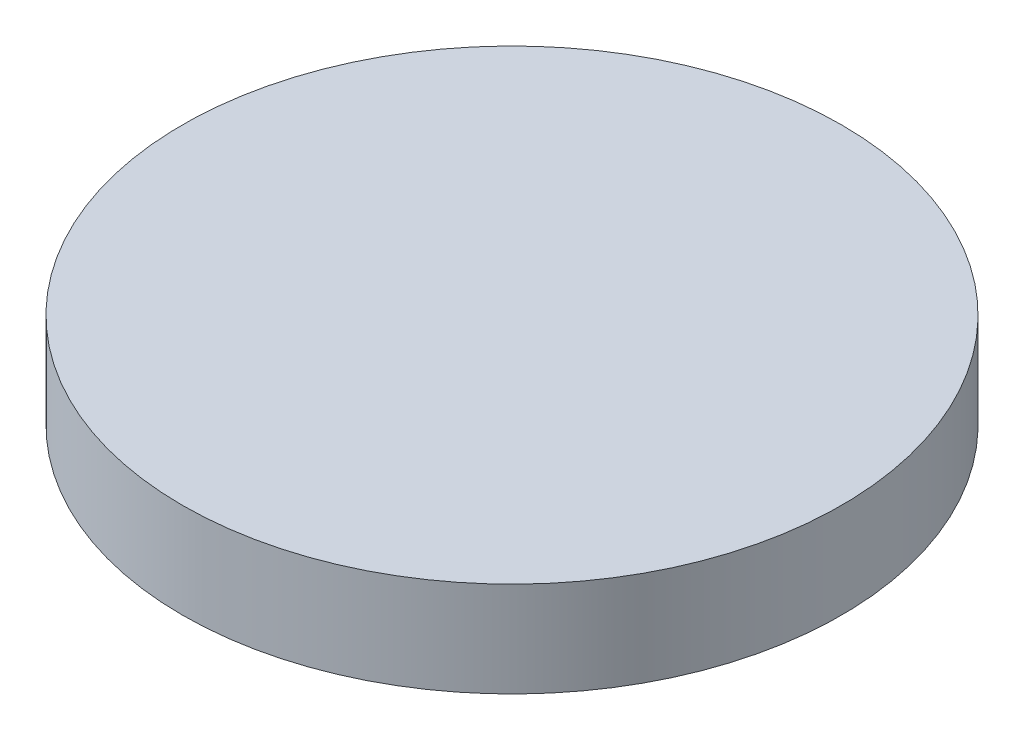
ISO-10303-21;
HEADER;
FILE_DESCRIPTION(('STEP AP214'),'2;1');
FILE_NAME('part.step','',(''),(''),'','','');
FILE_SCHEMA(('AUTOMOTIVE_DESIGN { 1 0 10303 214 1 1 1 1 }'));
ENDSEC;
DATA;
#1=APPLICATION_CONTEXT('core data for automotive mechanical design processes');
#2=APPLICATION_PROTOCOL_DEFINITION('international standard','automotive_design',2000,#1);
#3=PRODUCT_CONTEXT('',#1,'mechanical');
#4=PRODUCT('Part','Part','',(#3));
#5=PRODUCT_RELATED_PRODUCT_CATEGORY('part','',(#4));
#6=PRODUCT_DEFINITION_FORMATION('','',#4);
#7=PRODUCT_DEFINITION_CONTEXT('part definition',#1,'design');
#8=PRODUCT_DEFINITION('design','',#6,#7);
#9=PRODUCT_DEFINITION_SHAPE('','',#8);
#10=(LENGTH_UNIT() NAMED_UNIT(*) SI_UNIT(.MILLI.,.METRE.));
#11=(NAMED_UNIT(*) PLANE_ANGLE_UNIT() SI_UNIT($,.RADIAN.));
#12=(NAMED_UNIT(*) SI_UNIT($,.STERADIAN.) SOLID_ANGLE_UNIT());
#13=UNCERTAINTY_MEASURE_WITH_UNIT(LENGTH_MEASURE(1.E-05),#10,'distance_accuracy_value','');
#14=(GEOMETRIC_REPRESENTATION_CONTEXT(3) GLOBAL_UNCERTAINTY_ASSIGNED_CONTEXT((#13)) GLOBAL_UNIT_ASSIGNED_CONTEXT((#10,
#11,#12)) REPRESENTATION_CONTEXT('',''));
#15=CARTESIAN_POINT('',(0.,0.,0.));
#16=DIRECTION('',(0.,0.,1.));
#17=DIRECTION('',(1.,0.,0.));
#18=AXIS2_PLACEMENT_3D('',#15,#16,#17);
#19=CARTESIAN_POINT('',(0.,1.5875,0.));
#20=DIRECTION('',(0.,-1.,0.));
#21=DIRECTION('',(0.,0.,-1.));
#22=AXIS2_PLACEMENT_3D('',#19,#20,#21);
#23=CYLINDRICAL_SURFACE('',#22,5.5);
#24=CARTESIAN_POINT('',(0.,1.5875,0.));
#25=DIRECTION('',(0.,1.,0.));
#26=DIRECTION('',(0.,0.,1.));
#27=AXIS2_PLACEMENT_3D('',#24,#25,#26);
#28=CIRCLE('',#27,5.5);
#29=CARTESIAN_POINT('',(0.,1.5875,5.5));
#30=VERTEX_POINT('',#29);
#31=EDGE_CURVE('E10',#30,#30,#28,.T.);
#32=ORIENTED_EDGE('',*,*,#31,.F.);
#33=EDGE_LOOP('',(#32));
#34=FACE_BOUND('',#33,.T.);
#35=CARTESIAN_POINT('',(0.,0.,0.));
#36=DIRECTION('',(0.,1.,0.));
#37=DIRECTION('',(0.,0.,1.));
#38=AXIS2_PLACEMENT_3D('',#35,#36,#37);
#39=CIRCLE('',#38,5.5);
#40=CARTESIAN_POINT('',(0.,0.,5.5));
#41=VERTEX_POINT('',#40);
#42=EDGE_CURVE('E35',#41,#41,#39,.T.);
#43=ORIENTED_EDGE('',*,*,#42,.T.);
#44=EDGE_LOOP('',(#43));
#45=FACE_BOUND('',#44,.T.);
#46=ADVANCED_FACE('F32',(#34,#45),#23,.T.);
#47=CARTESIAN_POINT('',(0.,1.5875,0.));
#48=DIRECTION('',(0.,1.,0.));
#49=DIRECTION('',(0.,0.,1.));
#50=AXIS2_PLACEMENT_3D('',#47,#48,#49);
#51=PLANE('',#50);
#52=ORIENTED_EDGE('',*,*,#31,.T.);
#53=EDGE_LOOP('',(#52));
#54=FACE_BOUND('',#53,.T.);
#55=ADVANCED_FACE('F47',(#54),#51,.T.);
#56=CARTESIAN_POINT('',(0.,0.,0.));
#57=DIRECTION('',(0.,1.,0.));
#58=DIRECTION('',(0.,0.,1.));
#59=AXIS2_PLACEMENT_3D('',#56,#57,#58);
#60=PLANE('',#59);
#61=ORIENTED_EDGE('',*,*,#42,.F.);
#62=EDGE_LOOP('',(#61));
#63=FACE_BOUND('',#62,.T.);
#64=ADVANCED_FACE('F45',(#63),#60,.F.);
#65=CLOSED_SHELL('',(#46,#55,#64));
#66=MANIFOLD_SOLID_BREP('B2',#65);
#67=ADVANCED_BREP_SHAPE_REPRESENTATION('',(#18,#66),#14);
#68=SHAPE_DEFINITION_REPRESENTATION(#9,#67);
ENDSEC;
END-ISO-10303-21;
